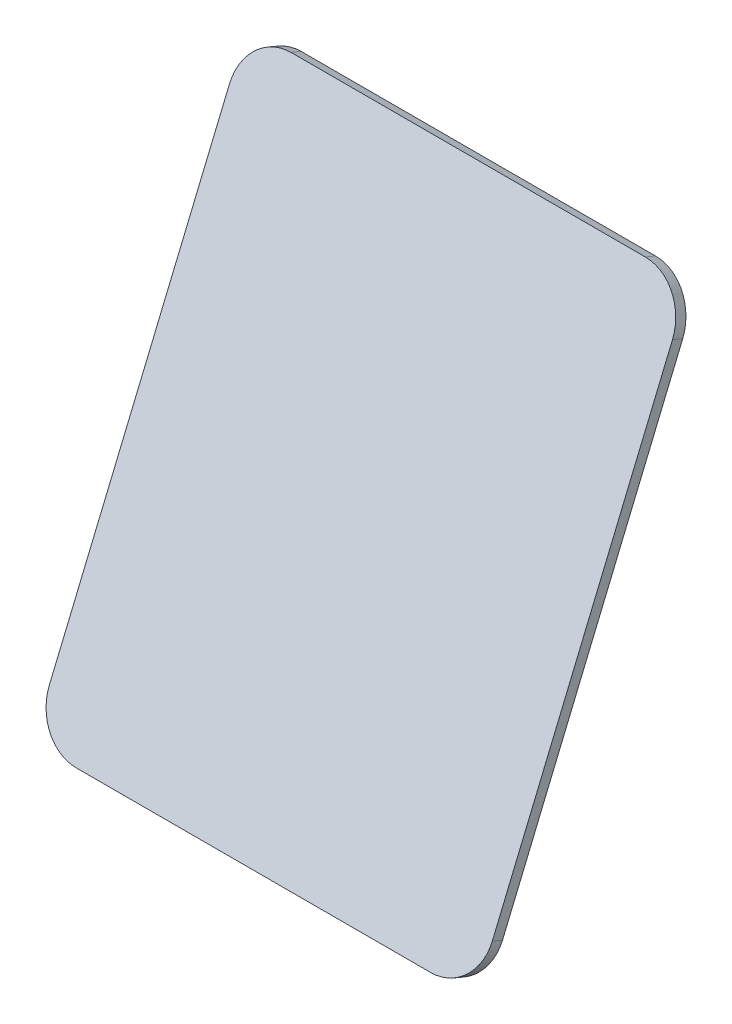
ISO-10303-21;
HEADER;
FILE_DESCRIPTION(('STEP AP214'),'2;1');
FILE_NAME('part.step','',(''),(''),'','','');
FILE_SCHEMA(('AUTOMOTIVE_DESIGN { 1 0 10303 214 1 1 1 1 }'));
ENDSEC;
DATA;
#1=APPLICATION_CONTEXT('core data for automotive mechanical design processes');
#2=APPLICATION_PROTOCOL_DEFINITION('international standard','automotive_design',2000,#1);
#3=PRODUCT_CONTEXT('',#1,'mechanical');
#4=PRODUCT('Part','Part','',(#3));
#5=PRODUCT_RELATED_PRODUCT_CATEGORY('part','',(#4));
#6=PRODUCT_DEFINITION_FORMATION('','',#4);
#7=PRODUCT_DEFINITION_CONTEXT('part definition',#1,'design');
#8=PRODUCT_DEFINITION('design','',#6,#7);
#9=PRODUCT_DEFINITION_SHAPE('','',#8);
#10=(LENGTH_UNIT() NAMED_UNIT(*) SI_UNIT(.MILLI.,.METRE.));
#11=(NAMED_UNIT(*) PLANE_ANGLE_UNIT() SI_UNIT($,.RADIAN.));
#12=(NAMED_UNIT(*) SI_UNIT($,.STERADIAN.) SOLID_ANGLE_UNIT());
#13=UNCERTAINTY_MEASURE_WITH_UNIT(LENGTH_MEASURE(1.E-05),#10,'distance_accuracy_value','');
#14=(GEOMETRIC_REPRESENTATION_CONTEXT(3) GLOBAL_UNCERTAINTY_ASSIGNED_CONTEXT((#13)) GLOBAL_UNIT_ASSIGNED_CONTEXT((#10,
#11,#12)) REPRESENTATION_CONTEXT('',''));
#15=CARTESIAN_POINT('',(0.,0.,0.));
#16=DIRECTION('',(0.,0.,1.));
#17=DIRECTION('',(1.,0.,0.));
#18=AXIS2_PLACEMENT_3D('',#15,#16,#17);
#19=CARTESIAN_POINT('',(105.441812484,327.611377319436,1098.09224328691));
#20=DIRECTION('',(1.,0.,0.));
#21=DIRECTION('',(0.,0.,-1.));
#22=AXIS2_PLACEMENT_3D('',#19,#20,#21);
#23=PLANE('',#22);
#24=DIRECTION('',(0.,0.922530236040005,-0.385924815983597));
#25=VECTOR('',#24,1.);
#26=CARTESIAN_POINT('',(105.441812484,328.836688610184,1101.02127678634));
#27=LINE('',#26,#25);
#28=CARTESIAN_POINT('',(105.441812484,193.619501834281,1157.58708448096));
#29=VERTEX_POINT('',#28);
#30=CARTESIAN_POINT('',(105.441812484,317.120554612476,1105.92252194933));
#31=VERTEX_POINT('',#30);
#32=EDGE_CURVE('E110',#29,#31,#27,.T.);
#33=ORIENTED_EDGE('',*,*,#32,.F.);
#34=DIRECTION('',(0.,0.385924815983597,0.922530236040005));
#35=VECTOR('',#34,1.);
#36=CARTESIAN_POINT('',(105.441812484,192.394190543533,1154.65805098153));
#37=LINE('',#36,#35);
#38=CARTESIAN_POINT('',(105.441812484,192.394190543533,1154.65805098153));
#39=VERTEX_POINT('',#38);
#40=EDGE_CURVE('E11',#29,#39,#37,.F.);
#41=ORIENTED_EDGE('',*,*,#40,.T.);
#42=DIRECTION('',(0.,0.922530236040005,-0.385924815983597));
#43=VECTOR('',#42,1.);
#44=CARTESIAN_POINT('',(105.441812484,327.611377319436,1098.09224328691));
#45=LINE('',#44,#43);
#46=CARTESIAN_POINT('',(105.441812484,315.895243321728,1102.99348844991));
#47=VERTEX_POINT('',#46);
#48=EDGE_CURVE('E160',#39,#47,#45,.T.);
#49=ORIENTED_EDGE('',*,*,#48,.T.);
#50=DIRECTION('',(0.,0.385924815983597,0.922530236040005));
#51=VECTOR('',#50,1.);
#52=CARTESIAN_POINT('',(105.441812484,315.895243321728,1102.99348844991));
#53=LINE('',#52,#51);
#54=EDGE_CURVE('E47',#47,#31,#53,.T.);
#55=ORIENTED_EDGE('',*,*,#54,.T.);
#56=EDGE_LOOP('',(#33,#41,#49,#55));
#57=FACE_BOUND('',#56,.T.);
#58=ADVANCED_FACE('F39',(#57),#23,.T.);
#59=CARTESIAN_POINT('',(105.441812484,180.678056545825,1159.55929614452));
#60=DIRECTION('',(0.,-0.922530236040005,0.385924815983597));
#61=DIRECTION('',(0.,-0.385924815983597,-0.922530236040005));
#62=AXIS2_PLACEMENT_3D('',#59,#60,#61);
#63=PLANE('',#62);
#64=DIRECTION('',(1.,0.,0.));
#65=VECTOR('',#64,1.);
#66=CARTESIAN_POINT('',(105.441812484,181.903367836573,1162.48832964395));
#67=LINE('',#66,#65);
#68=CARTESIAN_POINT('',(-8.85818751600005,181.903367836573,1162.48832964395));
#69=VERTEX_POINT('',#68);
#70=CARTESIAN_POINT('',(92.741812484,181.903367836573,1162.48832964395));
#71=VERTEX_POINT('',#70);
#72=EDGE_CURVE('E135',#69,#71,#67,.T.);
#73=ORIENTED_EDGE('',*,*,#72,.F.);
#74=DIRECTION('',(0.,0.385924815983597,0.922530236040005));
#75=VECTOR('',#74,1.);
#76=CARTESIAN_POINT('',(-8.85818751600005,180.678056545825,1159.55929614452));
#77=LINE('',#76,#75);
#78=CARTESIAN_POINT('',(-8.85818751600005,180.678056545825,1159.55929614452));
#79=VERTEX_POINT('',#78);
#80=EDGE_CURVE('E61',#69,#79,#77,.F.);
#81=ORIENTED_EDGE('',*,*,#80,.T.);
#82=DIRECTION('',(1.,0.,0.));
#83=VECTOR('',#82,1.);
#84=CARTESIAN_POINT('',(105.441812484,180.678056545825,1159.55929614452));
#85=LINE('',#84,#83);
#86=CARTESIAN_POINT('',(92.741812484,180.678056545825,1159.55929614452));
#87=VERTEX_POINT('',#86);
#88=EDGE_CURVE('E129',#79,#87,#85,.T.);
#89=ORIENTED_EDGE('',*,*,#88,.T.);
#90=DIRECTION('',(0.,0.385924815983597,0.922530236040005));
#91=VECTOR('',#90,1.);
#92=CARTESIAN_POINT('',(92.741812484,180.678056545825,1159.55929614452));
#93=LINE('',#92,#91);
#94=EDGE_CURVE('E154',#87,#71,#93,.T.);
#95=ORIENTED_EDGE('',*,*,#94,.T.);
#96=EDGE_LOOP('',(#73,#81,#89,#95));
#97=FACE_BOUND('',#96,.T.);
#98=ADVANCED_FACE('F192',(#97),#63,.T.);
#99=CARTESIAN_POINT('',(-21.5581875160001,327.611377319436,1098.09224328691));
#100=DIRECTION('',(-1.,0.,0.));
#101=DIRECTION('',(0.,-1.,0.));
#102=AXIS2_PLACEMENT_3D('',#99,#100,#101);
#103=PLANE('',#102);
#104=DIRECTION('',(0.,-0.922530236040005,0.385924815983597));
#105=VECTOR('',#104,1.);
#106=CARTESIAN_POINT('',(-21.5581875160001,328.836688610184,1101.02127678634));
#107=LINE('',#106,#105);
#108=CARTESIAN_POINT('',(-21.5581875160001,317.120554612476,1105.92252194933));
#109=VERTEX_POINT('',#108);
#110=CARTESIAN_POINT('',(-21.558187516,193.619501834281,1157.58708448096));
#111=VERTEX_POINT('',#110);
#112=EDGE_CURVE('E125',#109,#111,#107,.T.);
#113=ORIENTED_EDGE('',*,*,#112,.F.);
#114=DIRECTION('',(0.,0.385924815983597,0.922530236040005));
#115=VECTOR('',#114,1.);
#116=CARTESIAN_POINT('',(-21.5581875160001,315.895243321728,1102.99348844991));
#117=LINE('',#116,#115);
#118=CARTESIAN_POINT('',(-21.5581875160001,315.895243321728,1102.99348844991));
#119=VERTEX_POINT('',#118);
#120=EDGE_CURVE('E146',#109,#119,#117,.F.);
#121=ORIENTED_EDGE('',*,*,#120,.T.);
#122=DIRECTION('',(0.,-0.922530236040005,0.385924815983597));
#123=VECTOR('',#122,1.);
#124=CARTESIAN_POINT('',(-21.5581875160001,327.611377319436,1098.09224328691));
#125=LINE('',#124,#123);
#126=CARTESIAN_POINT('',(-21.558187516,192.394190543533,1154.65805098153));
#127=VERTEX_POINT('',#126);
#128=EDGE_CURVE('E132',#119,#127,#125,.T.);
#129=ORIENTED_EDGE('',*,*,#128,.T.);
#130=DIRECTION('',(0.,0.385924815983597,0.922530236040005));
#131=VECTOR('',#130,1.);
#132=CARTESIAN_POINT('',(-21.558187516,192.394190543533,1154.65805098153));
#133=LINE('',#132,#131);
#134=EDGE_CURVE('E143',#127,#111,#133,.T.);
#135=ORIENTED_EDGE('',*,*,#134,.T.);
#136=EDGE_LOOP('',(#113,#121,#129,#135));
#137=FACE_BOUND('',#136,.T.);
#138=ADVANCED_FACE('F172',(#137),#103,.T.);
#139=CARTESIAN_POINT('',(105.441812484,327.611377319436,1098.09224328691));
#140=DIRECTION('',(0.,0.922530236040005,-0.385924815983597));
#141=DIRECTION('',(0.,0.385924815983597,0.922530236040005));
#142=AXIS2_PLACEMENT_3D('',#139,#140,#141);
#143=PLANE('',#142);
#144=DIRECTION('',(-1.,0.,0.));
#145=VECTOR('',#144,1.);
#146=CARTESIAN_POINT('',(105.441812484,327.611377319436,1098.09224328691));
#147=LINE('',#146,#145);
#148=CARTESIAN_POINT('',(92.741812484,327.611377319436,1098.09224328691));
#149=VERTEX_POINT('',#148);
#150=CARTESIAN_POINT('',(-8.85818751600005,327.611377319436,1098.09224328691));
#151=VERTEX_POINT('',#150);
#152=EDGE_CURVE('E161',#149,#151,#147,.T.);
#153=ORIENTED_EDGE('',*,*,#152,.T.);
#154=DIRECTION('',(0.,0.385924815983597,0.922530236040005));
#155=VECTOR('',#154,1.);
#156=CARTESIAN_POINT('',(-8.85818751600005,327.611377319436,1098.09224328691));
#157=LINE('',#156,#155);
#158=CARTESIAN_POINT('',(-8.85818751600005,328.836688610184,1101.02127678634));
#159=VERTEX_POINT('',#158);
#160=EDGE_CURVE('E116',#151,#159,#157,.T.);
#161=ORIENTED_EDGE('',*,*,#160,.T.);
#162=DIRECTION('',(-1.,0.,0.));
#163=VECTOR('',#162,1.);
#164=CARTESIAN_POINT('',(105.441812484,328.836688610184,1101.02127678634));
#165=LINE('',#164,#163);
#166=CARTESIAN_POINT('',(92.741812484,328.836688610184,1101.02127678634));
#167=VERTEX_POINT('',#166);
#168=EDGE_CURVE('E108',#167,#159,#165,.T.);
#169=ORIENTED_EDGE('',*,*,#168,.F.);
#170=DIRECTION('',(0.,0.385924815983597,0.922530236040005));
#171=VECTOR('',#170,1.);
#172=CARTESIAN_POINT('',(92.741812484,327.611377319436,1098.09224328691));
#173=LINE('',#172,#171);
#174=EDGE_CURVE('E122',#167,#149,#173,.F.);
#175=ORIENTED_EDGE('',*,*,#174,.T.);
#176=EDGE_LOOP('',(#153,#161,#169,#175));
#177=FACE_BOUND('',#176,.T.);
#178=ADVANCED_FACE('F121',(#177),#143,.T.);
#179=CARTESIAN_POINT('',(1.92190433459053E-13,439.744600635151,1051.18321864668));
#180=DIRECTION('',(0.,-0.385924815983597,-0.922530236040005));
#181=DIRECTION('',(0.,0.922530236040005,-0.385924815983597));
#182=AXIS2_PLACEMENT_3D('',#179,#180,#181);
#183=PLANE('',#182);
#184=ORIENTED_EDGE('',*,*,#128,.F.);
#185=CARTESIAN_POINT('',(-8.85818751600005,315.895243321728,1102.99348844991));
#186=DIRECTION('',(0.,-0.385924815983597,-0.922530236040005));
#187=DIRECTION('',(0.,0.922530236040005,-0.385924815983597));
#188=AXIS2_PLACEMENT_3D('',#185,#186,#187);
#189=CIRCLE('',#188,12.7);
#190=EDGE_CURVE('E152',#119,#151,#189,.T.);
#191=ORIENTED_EDGE('',*,*,#190,.T.);
#192=ORIENTED_EDGE('',*,*,#152,.F.);
#193=CARTESIAN_POINT('',(92.741812484,315.895243321728,1102.99348844991));
#194=DIRECTION('',(0.,-0.385924815983597,-0.922530236040005));
#195=DIRECTION('',(0.,0.922530236040005,-0.385924815983597));
#196=AXIS2_PLACEMENT_3D('',#193,#194,#195);
#197=CIRCLE('',#196,12.7);
#198=EDGE_CURVE('E128',#149,#47,#197,.T.);
#199=ORIENTED_EDGE('',*,*,#198,.T.);
#200=ORIENTED_EDGE('',*,*,#48,.F.);
#201=CARTESIAN_POINT('',(92.741812484,192.394190543533,1154.65805098153));
#202=DIRECTION('',(0.,-0.385924815983597,-0.922530236040005));
#203=DIRECTION('',(0.,0.922530236040005,-0.385924815983597));
#204=AXIS2_PLACEMENT_3D('',#201,#202,#203);
#205=CIRCLE('',#204,12.7);
#206=EDGE_CURVE('E54',#39,#87,#205,.T.);
#207=ORIENTED_EDGE('',*,*,#206,.T.);
#208=ORIENTED_EDGE('',*,*,#88,.F.);
#209=CARTESIAN_POINT('',(-8.85818751600005,192.394190543533,1154.65805098153));
#210=DIRECTION('',(0.,-0.385924815983597,-0.922530236040005));
#211=DIRECTION('',(0.,0.922530236040005,-0.385924815983597));
#212=AXIS2_PLACEMENT_3D('',#209,#210,#211);
#213=CIRCLE('',#212,12.7);
#214=EDGE_CURVE('E150',#79,#127,#213,.T.);
#215=ORIENTED_EDGE('',*,*,#214,.T.);
#216=EDGE_LOOP('',(#184,#191,#192,#199,#200,#207,#208,#215));
#217=FACE_BOUND('',#216,.T.);
#218=ADVANCED_FACE('F178',(#217),#183,.T.);
#219=CARTESIAN_POINT('',(1.92225228326689E-13,440.969911925899,1054.1122521461));
#220=DIRECTION('',(0.,-0.385924815983597,-0.922530236040005));
#221=DIRECTION('',(0.,0.922530236040005,-0.385924815983597));
#222=AXIS2_PLACEMENT_3D('',#219,#220,#221);
#223=PLANE('',#222);
#224=ORIENTED_EDGE('',*,*,#168,.T.);
#225=CARTESIAN_POINT('',(-8.85818751600005,317.120554612476,1105.92252194933));
#226=DIRECTION('',(0.,-0.385924815983597,-0.922530236040005));
#227=DIRECTION('',(0.,0.922530236040005,-0.385924815983597));
#228=AXIS2_PLACEMENT_3D('',#225,#226,#227);
#229=CIRCLE('',#228,12.7);
#230=EDGE_CURVE('E141',#159,#109,#229,.F.);
#231=ORIENTED_EDGE('',*,*,#230,.T.);
#232=ORIENTED_EDGE('',*,*,#112,.T.);
#233=CARTESIAN_POINT('',(-8.85818751600005,193.619501834281,1157.58708448096));
#234=DIRECTION('',(0.,-0.385924815983597,-0.922530236040005));
#235=DIRECTION('',(0.,0.922530236040005,-0.385924815983597));
#236=AXIS2_PLACEMENT_3D('',#233,#234,#235);
#237=CIRCLE('',#236,12.7);
#238=EDGE_CURVE('E139',#111,#69,#237,.F.);
#239=ORIENTED_EDGE('',*,*,#238,.T.);
#240=ORIENTED_EDGE('',*,*,#72,.T.);
#241=CARTESIAN_POINT('',(92.741812484,193.619501834281,1157.58708448096));
#242=DIRECTION('',(0.,-0.385924815983597,-0.922530236040005));
#243=DIRECTION('',(0.,0.922530236040005,-0.385924815983597));
#244=AXIS2_PLACEMENT_3D('',#241,#242,#243);
#245=CIRCLE('',#244,12.7);
#246=EDGE_CURVE('E115',#71,#29,#245,.F.);
#247=ORIENTED_EDGE('',*,*,#246,.T.);
#248=ORIENTED_EDGE('',*,*,#32,.T.);
#249=CARTESIAN_POINT('',(92.741812484,317.120554612476,1105.92252194933));
#250=DIRECTION('',(0.,-0.385924815983597,-0.922530236040005));
#251=DIRECTION('',(0.,0.922530236040005,-0.385924815983597));
#252=AXIS2_PLACEMENT_3D('',#249,#250,#251);
#253=CIRCLE('',#252,12.7);
#254=EDGE_CURVE('E105',#31,#167,#253,.F.);
#255=ORIENTED_EDGE('',*,*,#254,.T.);
#256=EDGE_LOOP('',(#224,#231,#232,#239,#240,#247,#248,#255));
#257=FACE_BOUND('',#256,.T.);
#258=ADVANCED_FACE('F107',(#257),#223,.F.);
#259=CARTESIAN_POINT('',(-8.85818751600005,315.895243321728,1102.99348844991));
#260=DIRECTION('',(0.,0.385924815983597,0.922530236040005));
#261=DIRECTION('',(0.,-0.922530236040005,0.385924815983597));
#262=AXIS2_PLACEMENT_3D('',#259,#260,#261);
#263=CYLINDRICAL_SURFACE('',#262,12.7);
#264=ORIENTED_EDGE('',*,*,#190,.F.);
#265=ORIENTED_EDGE('',*,*,#120,.F.);
#266=ORIENTED_EDGE('',*,*,#230,.F.);
#267=ORIENTED_EDGE('',*,*,#160,.F.);
#268=EDGE_LOOP('',(#264,#265,#266,#267));
#269=FACE_BOUND('',#268,.T.);
#270=ADVANCED_FACE('F177',(#269),#263,.T.);
#271=CARTESIAN_POINT('',(-8.85818751600005,192.394190543533,1154.65805098153));
#272=DIRECTION('',(0.,0.385924815983597,0.922530236040005));
#273=DIRECTION('',(0.,-0.922530236040005,0.385924815983597));
#274=AXIS2_PLACEMENT_3D('',#271,#272,#273);
#275=CYLINDRICAL_SURFACE('',#274,12.7);
#276=ORIENTED_EDGE('',*,*,#214,.F.);
#277=ORIENTED_EDGE('',*,*,#80,.F.);
#278=ORIENTED_EDGE('',*,*,#238,.F.);
#279=ORIENTED_EDGE('',*,*,#134,.F.);
#280=EDGE_LOOP('',(#276,#277,#278,#279));
#281=FACE_BOUND('',#280,.T.);
#282=ADVANCED_FACE('F181',(#281),#275,.T.);
#283=CARTESIAN_POINT('',(92.741812484,192.394190543533,1154.65805098153));
#284=DIRECTION('',(0.,0.385924815983597,0.922530236040005));
#285=DIRECTION('',(0.,-0.922530236040005,0.385924815983597));
#286=AXIS2_PLACEMENT_3D('',#283,#284,#285);
#287=CYLINDRICAL_SURFACE('',#286,12.7);
#288=ORIENTED_EDGE('',*,*,#206,.F.);
#289=ORIENTED_EDGE('',*,*,#40,.F.);
#290=ORIENTED_EDGE('',*,*,#246,.F.);
#291=ORIENTED_EDGE('',*,*,#94,.F.);
#292=EDGE_LOOP('',(#288,#289,#290,#291));
#293=FACE_BOUND('',#292,.T.);
#294=ADVANCED_FACE('F183',(#293),#287,.T.);
#295=CARTESIAN_POINT('',(92.741812484,315.895243321728,1102.99348844991));
#296=DIRECTION('',(0.,0.385924815983597,0.922530236040005));
#297=DIRECTION('',(0.,-0.922530236040005,0.385924815983597));
#298=AXIS2_PLACEMENT_3D('',#295,#296,#297);
#299=CYLINDRICAL_SURFACE('',#298,12.7);
#300=ORIENTED_EDGE('',*,*,#198,.F.);
#301=ORIENTED_EDGE('',*,*,#174,.F.);
#302=ORIENTED_EDGE('',*,*,#254,.F.);
#303=ORIENTED_EDGE('',*,*,#54,.F.);
#304=EDGE_LOOP('',(#300,#301,#302,#303));
#305=FACE_BOUND('',#304,.T.);
#306=ADVANCED_FACE('F41',(#305),#299,.T.);
#307=CLOSED_SHELL('',(#58,#98,#138,#178,#218,#258,#270,#282,#294,#306));
#308=MANIFOLD_SOLID_BREP('B2',#307);
#309=ADVANCED_BREP_SHAPE_REPRESENTATION('',(#18,#308),#14);
#310=SHAPE_DEFINITION_REPRESENTATION(#9,#309);
ENDSEC;
END-ISO-10303-21;
